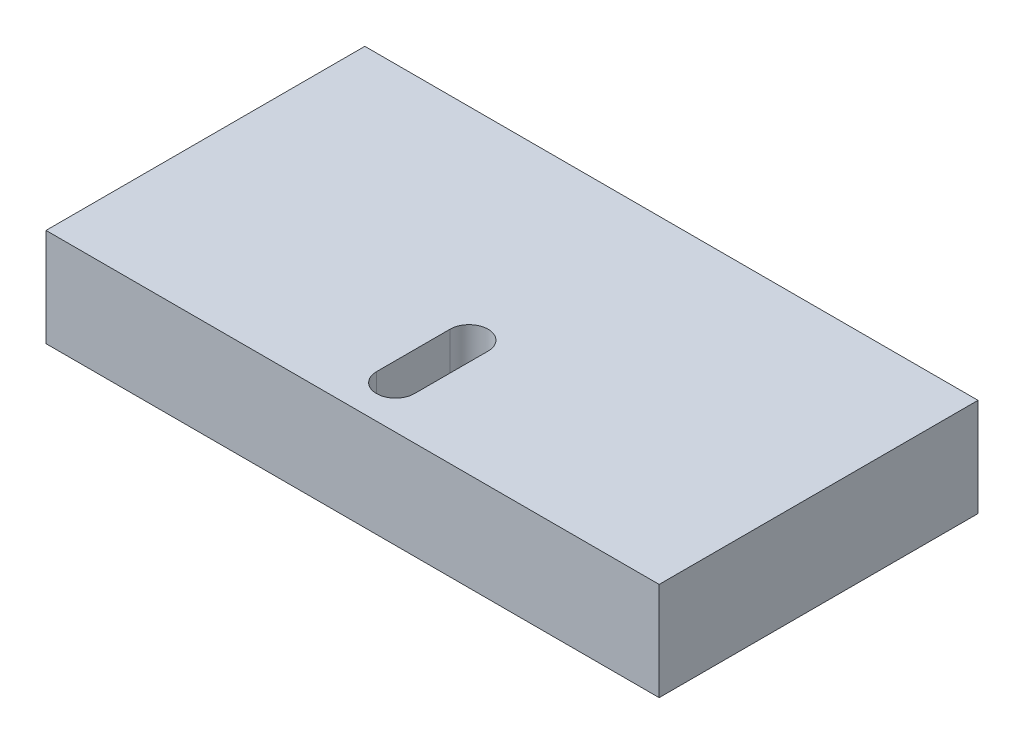
ISO-10303-21;
HEADER;
FILE_DESCRIPTION(('STEP AP214'),'2;1');
FILE_NAME('part.step','',(''),(''),'','','');
FILE_SCHEMA(('AUTOMOTIVE_DESIGN { 1 0 10303 214 1 1 1 1 }'));
ENDSEC;
DATA;
#1=APPLICATION_CONTEXT('core data for automotive mechanical design processes');
#2=APPLICATION_PROTOCOL_DEFINITION('international standard','automotive_design',2000,#1);
#3=PRODUCT_CONTEXT('',#1,'mechanical');
#4=PRODUCT('Part','Part','',(#3));
#5=PRODUCT_RELATED_PRODUCT_CATEGORY('part','',(#4));
#6=PRODUCT_DEFINITION_FORMATION('','',#4);
#7=PRODUCT_DEFINITION_CONTEXT('part definition',#1,'design');
#8=PRODUCT_DEFINITION('design','',#6,#7);
#9=PRODUCT_DEFINITION_SHAPE('','',#8);
#10=(LENGTH_UNIT() NAMED_UNIT(*) SI_UNIT(.MILLI.,.METRE.));
#11=(NAMED_UNIT(*) PLANE_ANGLE_UNIT() SI_UNIT($,.RADIAN.));
#12=(NAMED_UNIT(*) SI_UNIT($,.STERADIAN.) SOLID_ANGLE_UNIT());
#13=UNCERTAINTY_MEASURE_WITH_UNIT(LENGTH_MEASURE(1.E-05),#10,'distance_accuracy_value','');
#14=(GEOMETRIC_REPRESENTATION_CONTEXT(3) GLOBAL_UNCERTAINTY_ASSIGNED_CONTEXT((#13)) GLOBAL_UNIT_ASSIGNED_CONTEXT((#10,
#11,#12)) REPRESENTATION_CONTEXT('',''));
#15=CARTESIAN_POINT('',(0.,0.,0.));
#16=DIRECTION('',(0.,0.,1.));
#17=DIRECTION('',(1.,0.,0.));
#18=AXIS2_PLACEMENT_3D('',#15,#16,#17);
#19=CARTESIAN_POINT('',(0.,8.,0.));
#20=DIRECTION('',(0.,-1.,0.));
#21=DIRECTION('',(0.,0.,-1.));
#22=AXIS2_PLACEMENT_3D('',#19,#20,#21);
#23=PLANE('',#22);
#24=DIRECTION('',(0.,0.,-1.));
#25=VECTOR('',#24,1.);
#26=CARTESIAN_POINT('',(25.,8.,13.));
#27=LINE('',#26,#25);
#28=CARTESIAN_POINT('',(25.,8.,13.));
#29=VERTEX_POINT('',#28);
#30=CARTESIAN_POINT('',(25.,8.,-13.));
#31=VERTEX_POINT('',#30);
#32=EDGE_CURVE('E134',#29,#31,#27,.T.);
#33=ORIENTED_EDGE('',*,*,#32,.T.);
#34=DIRECTION('',(-1.,0.,0.));
#35=VECTOR('',#34,1.);
#36=CARTESIAN_POINT('',(-25.,8.,-13.));
#37=LINE('',#36,#35);
#38=CARTESIAN_POINT('',(-25.,8.,-13.));
#39=VERTEX_POINT('',#38);
#40=EDGE_CURVE('E137',#31,#39,#37,.T.);
#41=ORIENTED_EDGE('',*,*,#40,.T.);
#42=DIRECTION('',(0.,0.,1.));
#43=VECTOR('',#42,1.);
#44=CARTESIAN_POINT('',(-25.,8.,13.));
#45=LINE('',#44,#43);
#46=CARTESIAN_POINT('',(-25.,8.,13.));
#47=VERTEX_POINT('',#46);
#48=EDGE_CURVE('E140',#39,#47,#45,.T.);
#49=ORIENTED_EDGE('',*,*,#48,.T.);
#50=DIRECTION('',(1.,0.,0.));
#51=VECTOR('',#50,1.);
#52=CARTESIAN_POINT('',(-25.,8.,13.));
#53=LINE('',#52,#51);
#54=EDGE_CURVE('E142',#47,#29,#53,.T.);
#55=ORIENTED_EDGE('',*,*,#54,.T.);
#56=EDGE_LOOP('',(#33,#41,#49,#55));
#57=FACE_BOUND('',#56,.T.);
#58=CARTESIAN_POINT('',(0.,8.,9.49999999999999));
#59=DIRECTION('',(0.,1.,0.));
#60=DIRECTION('',(0.,0.,1.));
#61=AXIS2_PLACEMENT_3D('',#58,#59,#60);
#62=CIRCLE('',#61,1.55);
#63=CARTESIAN_POINT('',(-1.55,8.,9.49999999999999));
#64=VERTEX_POINT('',#63);
#65=CARTESIAN_POINT('',(1.55,8.,9.49999999999999));
#66=VERTEX_POINT('',#65);
#67=EDGE_CURVE('E98',#64,#66,#62,.T.);
#68=ORIENTED_EDGE('',*,*,#67,.F.);
#69=DIRECTION('',(0.,0.,1.));
#70=VECTOR('',#69,1.);
#71=CARTESIAN_POINT('',(-1.55,8.,9.49999999999999));
#72=LINE('',#71,#70);
#73=CARTESIAN_POINT('',(-1.55,8.,3.49999999999999));
#74=VERTEX_POINT('',#73);
#75=EDGE_CURVE('E120',#74,#64,#72,.T.);
#76=ORIENTED_EDGE('',*,*,#75,.F.);
#77=CARTESIAN_POINT('',(0.,8.,3.49999999999999));
#78=DIRECTION('',(0.,1.,0.));
#79=DIRECTION('',(0.,0.,1.));
#80=AXIS2_PLACEMENT_3D('',#77,#78,#79);
#81=CIRCLE('',#80,1.55);
#82=CARTESIAN_POINT('',(1.55,8.,3.49999999999999));
#83=VERTEX_POINT('',#82);
#84=EDGE_CURVE('E118',#83,#74,#81,.T.);
#85=ORIENTED_EDGE('',*,*,#84,.F.);
#86=DIRECTION('',(0.,0.,-1.));
#87=VECTOR('',#86,1.);
#88=CARTESIAN_POINT('',(1.55,8.,9.49999999999999));
#89=LINE('',#88,#87);
#90=EDGE_CURVE('E106',#66,#83,#89,.T.);
#91=ORIENTED_EDGE('',*,*,#90,.F.);
#92=EDGE_LOOP('',(#68,#76,#85,#91));
#93=FACE_BOUND('',#92,.T.);
#94=ADVANCED_FACE('F33',(#57,#93),#23,.F.);
#95=CARTESIAN_POINT('',(0.,0.,0.));
#96=DIRECTION('',(0.,-1.,0.));
#97=DIRECTION('',(0.,0.,-1.));
#98=AXIS2_PLACEMENT_3D('',#95,#96,#97);
#99=PLANE('',#98);
#100=DIRECTION('',(0.,0.,-1.));
#101=VECTOR('',#100,1.);
#102=CARTESIAN_POINT('',(25.,0.,13.));
#103=LINE('',#102,#101);
#104=CARTESIAN_POINT('',(25.,0.,13.));
#105=VERTEX_POINT('',#104);
#106=CARTESIAN_POINT('',(25.,0.,-13.));
#107=VERTEX_POINT('',#106);
#108=EDGE_CURVE('E114',#105,#107,#103,.T.);
#109=ORIENTED_EDGE('',*,*,#108,.F.);
#110=DIRECTION('',(1.,0.,0.));
#111=VECTOR('',#110,1.);
#112=CARTESIAN_POINT('',(-25.,0.,13.));
#113=LINE('',#112,#111);
#114=CARTESIAN_POINT('',(-25.,0.,13.));
#115=VERTEX_POINT('',#114);
#116=EDGE_CURVE('E138',#115,#105,#113,.T.);
#117=ORIENTED_EDGE('',*,*,#116,.F.);
#118=DIRECTION('',(0.,0.,1.));
#119=VECTOR('',#118,1.);
#120=CARTESIAN_POINT('',(-25.,0.,13.));
#121=LINE('',#120,#119);
#122=CARTESIAN_POINT('',(-25.,0.,-13.));
#123=VERTEX_POINT('',#122);
#124=EDGE_CURVE('E149',#123,#115,#121,.T.);
#125=ORIENTED_EDGE('',*,*,#124,.F.);
#126=DIRECTION('',(-1.,0.,0.));
#127=VECTOR('',#126,1.);
#128=CARTESIAN_POINT('',(-25.,0.,-13.));
#129=LINE('',#128,#127);
#130=EDGE_CURVE('E147',#107,#123,#129,.T.);
#131=ORIENTED_EDGE('',*,*,#130,.F.);
#132=EDGE_LOOP('',(#109,#117,#125,#131));
#133=FACE_BOUND('',#132,.T.);
#134=DIRECTION('',(0.,0.,1.));
#135=VECTOR('',#134,1.);
#136=CARTESIAN_POINT('',(-1.55,0.,9.49999999999999));
#137=LINE('',#136,#135);
#138=CARTESIAN_POINT('',(-1.55,0.,3.49999999999999));
#139=VERTEX_POINT('',#138);
#140=CARTESIAN_POINT('',(-1.55,0.,9.49999999999999));
#141=VERTEX_POINT('',#140);
#142=EDGE_CURVE('E107',#139,#141,#137,.T.);
#143=ORIENTED_EDGE('',*,*,#142,.T.);
#144=CARTESIAN_POINT('',(0.,0.,9.49999999999999));
#145=DIRECTION('',(0.,1.,0.));
#146=DIRECTION('',(0.,0.,1.));
#147=AXIS2_PLACEMENT_3D('',#144,#145,#146);
#148=CIRCLE('',#147,1.55);
#149=CARTESIAN_POINT('',(1.55,0.,9.49999999999999));
#150=VERTEX_POINT('',#149);
#151=EDGE_CURVE('E56',#141,#150,#148,.T.);
#152=ORIENTED_EDGE('',*,*,#151,.T.);
#153=DIRECTION('',(0.,0.,-1.));
#154=VECTOR('',#153,1.);
#155=CARTESIAN_POINT('',(1.55,0.,9.49999999999999));
#156=LINE('',#155,#154);
#157=CARTESIAN_POINT('',(1.55,0.,3.49999999999999));
#158=VERTEX_POINT('',#157);
#159=EDGE_CURVE('E113',#150,#158,#156,.T.);
#160=ORIENTED_EDGE('',*,*,#159,.T.);
#161=CARTESIAN_POINT('',(0.,0.,3.49999999999999));
#162=DIRECTION('',(0.,1.,0.));
#163=DIRECTION('',(0.,0.,1.));
#164=AXIS2_PLACEMENT_3D('',#161,#162,#163);
#165=CIRCLE('',#164,1.55);
#166=EDGE_CURVE('E126',#158,#139,#165,.T.);
#167=ORIENTED_EDGE('',*,*,#166,.T.);
#168=EDGE_LOOP('',(#143,#152,#160,#167));
#169=FACE_BOUND('',#168,.T.);
#170=ADVANCED_FACE('F167',(#133,#169),#99,.T.);
#171=CARTESIAN_POINT('',(25.,8.,13.));
#172=DIRECTION('',(-1.,0.,0.));
#173=DIRECTION('',(0.,0.,1.));
#174=AXIS2_PLACEMENT_3D('',#171,#172,#173);
#175=PLANE('',#174);
#176=ORIENTED_EDGE('',*,*,#108,.T.);
#177=DIRECTION('',(0.,-1.,0.));
#178=VECTOR('',#177,1.);
#179=CARTESIAN_POINT('',(25.,8.,-13.));
#180=LINE('',#179,#178);
#181=EDGE_CURVE('E11',#31,#107,#180,.T.);
#182=ORIENTED_EDGE('',*,*,#181,.F.);
#183=ORIENTED_EDGE('',*,*,#32,.F.);
#184=DIRECTION('',(0.,-1.,0.));
#185=VECTOR('',#184,1.);
#186=CARTESIAN_POINT('',(25.,8.,13.));
#187=LINE('',#186,#185);
#188=EDGE_CURVE('E144',#29,#105,#187,.T.);
#189=ORIENTED_EDGE('',*,*,#188,.T.);
#190=EDGE_LOOP('',(#176,#182,#183,#189));
#191=FACE_BOUND('',#190,.T.);
#192=ADVANCED_FACE('F35',(#191),#175,.F.);
#193=CARTESIAN_POINT('',(-25.,8.,-13.));
#194=DIRECTION('',(0.,0.,1.));
#195=DIRECTION('',(1.,0.,0.));
#196=AXIS2_PLACEMENT_3D('',#193,#194,#195);
#197=PLANE('',#196);
#198=ORIENTED_EDGE('',*,*,#130,.T.);
#199=DIRECTION('',(0.,-1.,0.));
#200=VECTOR('',#199,1.);
#201=CARTESIAN_POINT('',(-25.,8.,-13.));
#202=LINE('',#201,#200);
#203=EDGE_CURVE('E41',#39,#123,#202,.T.);
#204=ORIENTED_EDGE('',*,*,#203,.F.);
#205=ORIENTED_EDGE('',*,*,#40,.F.);
#206=ORIENTED_EDGE('',*,*,#181,.T.);
#207=EDGE_LOOP('',(#198,#204,#205,#206));
#208=FACE_BOUND('',#207,.T.);
#209=ADVANCED_FACE('F177',(#208),#197,.F.);
#210=CARTESIAN_POINT('',(-25.,8.,13.));
#211=DIRECTION('',(1.,0.,0.));
#212=DIRECTION('',(0.,0.,-1.));
#213=AXIS2_PLACEMENT_3D('',#210,#211,#212);
#214=PLANE('',#213);
#215=ORIENTED_EDGE('',*,*,#124,.T.);
#216=DIRECTION('',(0.,-1.,0.));
#217=VECTOR('',#216,1.);
#218=CARTESIAN_POINT('',(-25.,8.,13.));
#219=LINE('',#218,#217);
#220=EDGE_CURVE('E154',#47,#115,#219,.T.);
#221=ORIENTED_EDGE('',*,*,#220,.F.);
#222=ORIENTED_EDGE('',*,*,#48,.F.);
#223=ORIENTED_EDGE('',*,*,#203,.T.);
#224=EDGE_LOOP('',(#215,#221,#222,#223));
#225=FACE_BOUND('',#224,.T.);
#226=ADVANCED_FACE('F161',(#225),#214,.F.);
#227=CARTESIAN_POINT('',(-25.,8.,13.));
#228=DIRECTION('',(0.,0.,-1.));
#229=DIRECTION('',(-1.,0.,0.));
#230=AXIS2_PLACEMENT_3D('',#227,#228,#229);
#231=PLANE('',#230);
#232=ORIENTED_EDGE('',*,*,#116,.T.);
#233=ORIENTED_EDGE('',*,*,#188,.F.);
#234=ORIENTED_EDGE('',*,*,#54,.F.);
#235=ORIENTED_EDGE('',*,*,#220,.T.);
#236=EDGE_LOOP('',(#232,#233,#234,#235));
#237=FACE_BOUND('',#236,.T.);
#238=ADVANCED_FACE('F171',(#237),#231,.F.);
#239=CARTESIAN_POINT('',(0.,8.,9.49999999999999));
#240=DIRECTION('',(0.,-1.,0.));
#241=DIRECTION('',(0.,0.,-1.));
#242=AXIS2_PLACEMENT_3D('',#239,#240,#241);
#243=CYLINDRICAL_SURFACE('',#242,1.55);
#244=ORIENTED_EDGE('',*,*,#151,.F.);
#245=DIRECTION('',(0.,-1.,0.));
#246=VECTOR('',#245,1.);
#247=CARTESIAN_POINT('',(-1.55,8.,9.49999999999999));
#248=LINE('',#247,#246);
#249=EDGE_CURVE('E102',#64,#141,#248,.T.);
#250=ORIENTED_EDGE('',*,*,#249,.F.);
#251=ORIENTED_EDGE('',*,*,#67,.T.);
#252=DIRECTION('',(0.,-1.,0.));
#253=VECTOR('',#252,1.);
#254=CARTESIAN_POINT('',(1.55,8.,9.49999999999999));
#255=LINE('',#254,#253);
#256=EDGE_CURVE('E101',#66,#150,#255,.T.);
#257=ORIENTED_EDGE('',*,*,#256,.T.);
#258=EDGE_LOOP('',(#244,#250,#251,#257));
#259=FACE_BOUND('',#258,.T.);
#260=ADVANCED_FACE('F100',(#259),#243,.F.);
#261=CARTESIAN_POINT('',(1.55,8.,9.49999999999999));
#262=DIRECTION('',(-1.,0.,0.));
#263=DIRECTION('',(0.,0.,1.));
#264=AXIS2_PLACEMENT_3D('',#261,#262,#263);
#265=PLANE('',#264);
#266=ORIENTED_EDGE('',*,*,#159,.F.);
#267=ORIENTED_EDGE('',*,*,#256,.F.);
#268=ORIENTED_EDGE('',*,*,#90,.T.);
#269=DIRECTION('',(0.,-1.,0.));
#270=VECTOR('',#269,1.);
#271=CARTESIAN_POINT('',(1.55,8.,3.49999999999999));
#272=LINE('',#271,#270);
#273=EDGE_CURVE('E115',#83,#158,#272,.T.);
#274=ORIENTED_EDGE('',*,*,#273,.T.);
#275=EDGE_LOOP('',(#266,#267,#268,#274));
#276=FACE_BOUND('',#275,.T.);
#277=ADVANCED_FACE('F110',(#276),#265,.T.);
#278=CARTESIAN_POINT('',(0.,8.,3.49999999999999));
#279=DIRECTION('',(0.,-1.,0.));
#280=DIRECTION('',(0.,0.,-1.));
#281=AXIS2_PLACEMENT_3D('',#278,#279,#280);
#282=CYLINDRICAL_SURFACE('',#281,1.55);
#283=ORIENTED_EDGE('',*,*,#166,.F.);
#284=ORIENTED_EDGE('',*,*,#273,.F.);
#285=ORIENTED_EDGE('',*,*,#84,.T.);
#286=DIRECTION('',(0.,-1.,0.));
#287=VECTOR('',#286,1.);
#288=CARTESIAN_POINT('',(-1.55,8.,3.49999999999999));
#289=LINE('',#288,#287);
#290=EDGE_CURVE('E48',#74,#139,#289,.T.);
#291=ORIENTED_EDGE('',*,*,#290,.T.);
#292=EDGE_LOOP('',(#283,#284,#285,#291));
#293=FACE_BOUND('',#292,.T.);
#294=ADVANCED_FACE('F200',(#293),#282,.F.);
#295=CARTESIAN_POINT('',(-1.55,8.,9.49999999999999));
#296=DIRECTION('',(1.,0.,0.));
#297=DIRECTION('',(0.,0.,-1.));
#298=AXIS2_PLACEMENT_3D('',#295,#296,#297);
#299=PLANE('',#298);
#300=ORIENTED_EDGE('',*,*,#142,.F.);
#301=ORIENTED_EDGE('',*,*,#290,.F.);
#302=ORIENTED_EDGE('',*,*,#75,.T.);
#303=ORIENTED_EDGE('',*,*,#249,.T.);
#304=EDGE_LOOP('',(#300,#301,#302,#303));
#305=FACE_BOUND('',#304,.T.);
#306=ADVANCED_FACE('F204',(#305),#299,.T.);
#307=CLOSED_SHELL('',(#94,#170,#192,#209,#226,#238,#260,#277,#294,#306));
#308=MANIFOLD_SOLID_BREP('B2',#307);
#309=ADVANCED_BREP_SHAPE_REPRESENTATION('',(#18,#308),#14);
#310=SHAPE_DEFINITION_REPRESENTATION(#9,#309);
ENDSEC;
END-ISO-10303-21;
